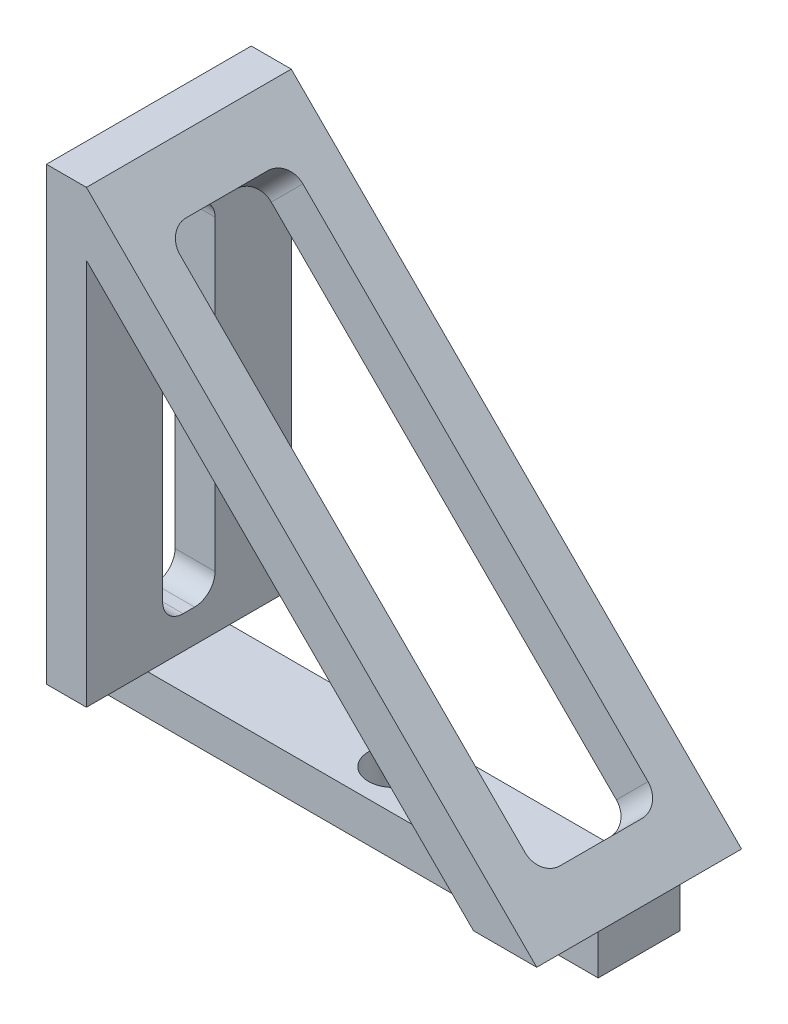
ISO-10303-21;
HEADER;
FILE_DESCRIPTION(('STEP AP214'),'2;1');
FILE_NAME('part.step','',(''),(''),'','','');
FILE_SCHEMA(('AUTOMOTIVE_DESIGN { 1 0 10303 214 1 1 1 1 }'));
ENDSEC;
DATA;
#1=APPLICATION_CONTEXT('core data for automotive mechanical design processes');
#2=APPLICATION_PROTOCOL_DEFINITION('international standard','automotive_design',2000,#1);
#3=PRODUCT_CONTEXT('',#1,'mechanical');
#4=PRODUCT('Part','Part','',(#3));
#5=PRODUCT_RELATED_PRODUCT_CATEGORY('part','',(#4));
#6=PRODUCT_DEFINITION_FORMATION('','',#4);
#7=PRODUCT_DEFINITION_CONTEXT('part definition',#1,'design');
#8=PRODUCT_DEFINITION('design','',#6,#7);
#9=PRODUCT_DEFINITION_SHAPE('','',#8);
#10=(LENGTH_UNIT() NAMED_UNIT(*) SI_UNIT(.MILLI.,.METRE.));
#11=(NAMED_UNIT(*) PLANE_ANGLE_UNIT() SI_UNIT($,.RADIAN.));
#12=(NAMED_UNIT(*) SI_UNIT($,.STERADIAN.) SOLID_ANGLE_UNIT());
#13=UNCERTAINTY_MEASURE_WITH_UNIT(LENGTH_MEASURE(1.E-05),#10,'distance_accuracy_value','');
#14=(GEOMETRIC_REPRESENTATION_CONTEXT(3) GLOBAL_UNCERTAINTY_ASSIGNED_CONTEXT((#13)) GLOBAL_UNIT_ASSIGNED_CONTEXT((#10,
#11,#12)) REPRESENTATION_CONTEXT('',''));
#15=CARTESIAN_POINT('',(0.,0.,0.));
#16=DIRECTION('',(0.,0.,1.));
#17=DIRECTION('',(1.,0.,0.));
#18=AXIS2_PLACEMENT_3D('',#15,#16,#17);
#19=CARTESIAN_POINT('',(0.,0.,15.875));
#20=DIRECTION('',(0.,0.,-1.));
#21=DIRECTION('',(-1.,0.,0.));
#22=AXIS2_PLACEMENT_3D('',#19,#20,#21);
#23=PLANE('',#22);
#24=DIRECTION('',(0.,-1.,0.));
#25=VECTOR('',#24,1.);
#26=CARTESIAN_POINT('',(-6.20000000000001,69.8,15.875));
#27=LINE('',#26,#25);
#28=CARTESIAN_POINT('',(-6.20000000000001,69.8,15.875));
#29=VERTEX_POINT('',#28);
#30=CARTESIAN_POINT('',(-6.20000000000001,0.,15.875));
#31=VERTEX_POINT('',#30);
#32=EDGE_CURVE('E419',#29,#31,#27,.T.);
#33=ORIENTED_EDGE('',*,*,#32,.T.);
#34=DIRECTION('',(1.,0.,0.));
#35=VECTOR('',#34,1.);
#36=CARTESIAN_POINT('',(-6.20100000000001,0.,15.875));
#37=LINE('',#36,#35);
#38=CARTESIAN_POINT('',(0.,0.,15.875));
#39=VERTEX_POINT('',#38);
#40=EDGE_CURVE('E452',#31,#39,#37,.T.);
#41=ORIENTED_EDGE('',*,*,#40,.T.);
#42=DIRECTION('',(0.,-1.,0.));
#43=VECTOR('',#42,1.);
#44=CARTESIAN_POINT('',(0.,0.,15.875));
#45=LINE('',#44,#43);
#46=CARTESIAN_POINT('',(0.,60.,15.875));
#47=VERTEX_POINT('',#46);
#48=EDGE_CURVE('E391',#47,#39,#45,.T.);
#49=ORIENTED_EDGE('',*,*,#48,.F.);
#50=DIRECTION('',(-0.707106781186547,0.707106781186547,0.));
#51=VECTOR('',#50,1.);
#52=CARTESIAN_POINT('',(0.,60.,15.875));
#53=LINE('',#52,#51);
#54=CARTESIAN_POINT('',(60.,0.,15.875));
#55=VERTEX_POINT('',#54);
#56=EDGE_CURVE('E394',#55,#47,#53,.T.);
#57=ORIENTED_EDGE('',*,*,#56,.F.);
#58=CARTESIAN_POINT('',(69.8,0.,15.875));
#59=VERTEX_POINT('',#58);
#60=EDGE_CURVE('E580',#55,#59,#37,.T.);
#61=ORIENTED_EDGE('',*,*,#60,.T.);
#62=DIRECTION('',(-0.707106781186548,0.707106781186547,0.));
#63=VECTOR('',#62,1.);
#64=CARTESIAN_POINT('',(0.,69.8,15.875));
#65=LINE('',#64,#63);
#66=CARTESIAN_POINT('',(0.,69.8,15.875));
#67=VERTEX_POINT('',#66);
#68=EDGE_CURVE('E413',#59,#67,#65,.T.);
#69=ORIENTED_EDGE('',*,*,#68,.T.);
#70=DIRECTION('',(-1.,0.,0.));
#71=VECTOR('',#70,1.);
#72=CARTESIAN_POINT('',(-6.20000000000001,69.8,15.875));
#73=LINE('',#72,#71);
#74=EDGE_CURVE('E416',#67,#29,#73,.T.);
#75=ORIENTED_EDGE('',*,*,#74,.T.);
#76=EDGE_LOOP('',(#33,#41,#49,#57,#61,#69,#75));
#77=FACE_BOUND('',#76,.T.);
#78=ADVANCED_FACE('F38',(#77),#23,.F.);
#79=CARTESIAN_POINT('',(0.,0.,-15.875));
#80=DIRECTION('',(0.,0.,-1.));
#81=DIRECTION('',(-1.,0.,0.));
#82=AXIS2_PLACEMENT_3D('',#79,#80,#81);
#83=PLANE('',#82);
#84=DIRECTION('',(1.,0.,0.));
#85=VECTOR('',#84,1.);
#86=CARTESIAN_POINT('',(-6.20100000000001,0.,-15.875));
#87=LINE('',#86,#85);
#88=CARTESIAN_POINT('',(-6.20000000000001,0.,-15.875));
#89=VERTEX_POINT('',#88);
#90=CARTESIAN_POINT('',(0.,0.,-15.875));
#91=VERTEX_POINT('',#90);
#92=EDGE_CURVE('E436',#89,#91,#87,.T.);
#93=ORIENTED_EDGE('',*,*,#92,.F.);
#94=DIRECTION('',(0.,-1.,0.));
#95=VECTOR('',#94,1.);
#96=CARTESIAN_POINT('',(-6.20000000000001,69.8,-15.875));
#97=LINE('',#96,#95);
#98=CARTESIAN_POINT('',(-6.20000000000001,69.8,-15.875));
#99=VERTEX_POINT('',#98);
#100=EDGE_CURVE('E417',#99,#89,#97,.T.);
#101=ORIENTED_EDGE('',*,*,#100,.F.);
#102=DIRECTION('',(-1.,0.,0.));
#103=VECTOR('',#102,1.);
#104=CARTESIAN_POINT('',(-6.20000000000001,69.8,-15.875));
#105=LINE('',#104,#103);
#106=CARTESIAN_POINT('',(0.,69.8,-15.875));
#107=VERTEX_POINT('',#106);
#108=EDGE_CURVE('E424',#107,#99,#105,.T.);
#109=ORIENTED_EDGE('',*,*,#108,.F.);
#110=DIRECTION('',(-0.707106781186548,0.707106781186547,0.));
#111=VECTOR('',#110,1.);
#112=CARTESIAN_POINT('',(0.,69.8,-15.875));
#113=LINE('',#112,#111);
#114=CARTESIAN_POINT('',(69.8,0.,-15.875));
#115=VERTEX_POINT('',#114);
#116=EDGE_CURVE('E412',#115,#107,#113,.T.);
#117=ORIENTED_EDGE('',*,*,#116,.F.);
#118=CARTESIAN_POINT('',(60.,0.,-15.875));
#119=VERTEX_POINT('',#118);
#120=EDGE_CURVE('E440',#119,#115,#87,.T.);
#121=ORIENTED_EDGE('',*,*,#120,.F.);
#122=DIRECTION('',(-0.707106781186547,0.707106781186547,0.));
#123=VECTOR('',#122,1.);
#124=CARTESIAN_POINT('',(0.,60.,-15.875));
#125=LINE('',#124,#123);
#126=CARTESIAN_POINT('',(0.,60.,-15.875));
#127=VERTEX_POINT('',#126);
#128=EDGE_CURVE('E395',#119,#127,#125,.T.);
#129=ORIENTED_EDGE('',*,*,#128,.T.);
#130=DIRECTION('',(0.,-1.,0.));
#131=VECTOR('',#130,1.);
#132=CARTESIAN_POINT('',(0.,0.,-15.875));
#133=LINE('',#132,#131);
#134=EDGE_CURVE('E390',#127,#91,#133,.T.);
#135=ORIENTED_EDGE('',*,*,#134,.T.);
#136=EDGE_LOOP('',(#93,#101,#109,#117,#121,#129,#135));
#137=FACE_BOUND('',#136,.T.);
#138=ADVANCED_FACE('F434',(#137),#83,.T.);
#139=CARTESIAN_POINT('',(0.,69.8,15.875));
#140=DIRECTION('',(-0.707106781186547,-0.707106781186548,0.));
#141=DIRECTION('',(0.707106781186548,-0.707106781186547,0.));
#142=AXIS2_PLACEMENT_3D('',#139,#140,#141);
#143=PLANE('',#142);
#144=DIRECTION('',(0.707106781186548,-0.707106781186547,0.));
#145=VECTOR('',#144,1.);
#146=CARTESIAN_POINT('',(63.8913780286485,5.90862197135156,9.525));
#147=LINE('',#146,#145);
#148=CARTESIAN_POINT('',(8.15368600161884,61.6463139983812,9.525));
#149=VERTEX_POINT('',#148);
#150=CARTESIAN_POINT('',(61.6463139983812,8.15368600161885,9.525));
#151=VERTEX_POINT('',#150);
#152=EDGE_CURVE('E381',#149,#151,#147,.T.);
#153=ORIENTED_EDGE('',*,*,#152,.F.);
#154=CARTESIAN_POINT('',(8.15368600161884,61.6463139983812,6.35));
#155=DIRECTION('',(-0.707106781186547,-0.707106781186548,0.));
#156=DIRECTION('',(0.707106781186548,-0.707106781186547,0.));
#157=AXIS2_PLACEMENT_3D('',#154,#155,#156);
#158=CIRCLE('',#157,3.175);
#159=CARTESIAN_POINT('',(5.90862197135155,63.8913780286485,6.35));
#160=VERTEX_POINT('',#159);
#161=EDGE_CURVE('E301',#149,#160,#158,.T.);
#162=ORIENTED_EDGE('',*,*,#161,.T.);
#163=DIRECTION('',(0.,0.,1.));
#164=VECTOR('',#163,1.);
#165=CARTESIAN_POINT('',(5.90862197135155,63.8913780286485,9.525));
#166=LINE('',#165,#164);
#167=CARTESIAN_POINT('',(5.90862197135155,63.8913780286485,-6.34999999999999));
#168=VERTEX_POINT('',#167);
#169=EDGE_CURVE('E378',#168,#160,#166,.T.);
#170=ORIENTED_EDGE('',*,*,#169,.F.);
#171=CARTESIAN_POINT('',(8.15368600161883,61.6463139983812,-6.35));
#172=DIRECTION('',(-0.707106781186547,-0.707106781186548,0.));
#173=DIRECTION('',(0.707106781186548,-0.707106781186547,0.));
#174=AXIS2_PLACEMENT_3D('',#171,#172,#173);
#175=CIRCLE('',#174,3.175);
#176=CARTESIAN_POINT('',(8.15368600161884,61.6463139983812,-9.525));
#177=VERTEX_POINT('',#176);
#178=EDGE_CURVE('E297',#168,#177,#175,.T.);
#179=ORIENTED_EDGE('',*,*,#178,.T.);
#180=DIRECTION('',(-0.707106781186548,0.707106781186547,0.));
#181=VECTOR('',#180,1.);
#182=CARTESIAN_POINT('',(63.8913780286485,5.90862197135156,-9.525));
#183=LINE('',#182,#181);
#184=CARTESIAN_POINT('',(61.6463139983812,8.15368600161885,-9.525));
#185=VERTEX_POINT('',#184);
#186=EDGE_CURVE('E375',#185,#177,#183,.T.);
#187=ORIENTED_EDGE('',*,*,#186,.F.);
#188=CARTESIAN_POINT('',(61.6463139983812,8.15368600161884,-6.35));
#189=DIRECTION('',(-0.707106781186547,-0.707106781186548,0.));
#190=DIRECTION('',(0.707106781186548,-0.707106781186547,0.));
#191=AXIS2_PLACEMENT_3D('',#188,#189,#190);
#192=CIRCLE('',#191,3.175);
#193=CARTESIAN_POINT('',(63.8913780286485,5.90862197135156,-6.34999999999999));
#194=VERTEX_POINT('',#193);
#195=EDGE_CURVE('E293',#185,#194,#192,.T.);
#196=ORIENTED_EDGE('',*,*,#195,.T.);
#197=DIRECTION('',(0.,0.,-1.));
#198=VECTOR('',#197,1.);
#199=CARTESIAN_POINT('',(63.8913780286485,5.90862197135156,9.525));
#200=LINE('',#199,#198);
#201=CARTESIAN_POINT('',(63.8913780286485,5.90862197135156,6.35));
#202=VERTEX_POINT('',#201);
#203=EDGE_CURVE('E384',#202,#194,#200,.T.);
#204=ORIENTED_EDGE('',*,*,#203,.F.);
#205=CARTESIAN_POINT('',(61.6463139983812,8.15368600161884,6.35));
#206=DIRECTION('',(-0.707106781186547,-0.707106781186548,0.));
#207=DIRECTION('',(0.707106781186548,-0.707106781186547,0.));
#208=AXIS2_PLACEMENT_3D('',#205,#206,#207);
#209=CIRCLE('',#208,3.175);
#210=EDGE_CURVE('E289',#202,#151,#209,.T.);
#211=ORIENTED_EDGE('',*,*,#210,.T.);
#212=EDGE_LOOP('',(#153,#162,#170,#179,#187,#196,#204,#211));
#213=FACE_BOUND('',#212,.T.);
#214=ORIENTED_EDGE('',*,*,#116,.T.);
#215=DIRECTION('',(0.,0.,-1.));
#216=VECTOR('',#215,1.);
#217=CARTESIAN_POINT('',(0.,69.8,15.875));
#218=LINE('',#217,#216);
#219=EDGE_CURVE('E266',#67,#107,#218,.T.);
#220=ORIENTED_EDGE('',*,*,#219,.F.);
#221=ORIENTED_EDGE('',*,*,#68,.F.);
#222=DIRECTION('',(0.,0.,-1.));
#223=VECTOR('',#222,1.);
#224=CARTESIAN_POINT('',(69.8,0.,15.875));
#225=LINE('',#224,#223);
#226=CARTESIAN_POINT('',(69.8,0.,6.35));
#227=VERTEX_POINT('',#226);
#228=EDGE_CURVE('E257',#59,#227,#225,.T.);
#229=ORIENTED_EDGE('',*,*,#228,.T.);
#230=CARTESIAN_POINT('',(69.8,0.,-6.35));
#231=VERTEX_POINT('',#230);
#232=EDGE_CURVE('E249',#227,#231,#225,.T.);
#233=ORIENTED_EDGE('',*,*,#232,.T.);
#234=DIRECTION('',(0.,0.,1.));
#235=VECTOR('',#234,1.);
#236=CARTESIAN_POINT('',(69.8,0.,-15.875));
#237=LINE('',#236,#235);
#238=EDGE_CURVE('E564',#115,#231,#237,.T.);
#239=ORIENTED_EDGE('',*,*,#238,.F.);
#240=EDGE_LOOP('',(#214,#220,#221,#229,#233,#239));
#241=FACE_BOUND('',#240,.T.);
#242=ADVANCED_FACE('F492',(#213,#241),#143,.F.);
#243=CARTESIAN_POINT('',(-6.20000000000001,69.8,15.875));
#244=DIRECTION('',(0.,-1.,0.));
#245=DIRECTION('',(1.,0.,0.));
#246=AXIS2_PLACEMENT_3D('',#243,#244,#245);
#247=PLANE('',#246);
#248=ORIENTED_EDGE('',*,*,#108,.T.);
#249=DIRECTION('',(0.,0.,-1.));
#250=VECTOR('',#249,1.);
#251=CARTESIAN_POINT('',(-6.20000000000001,69.8,15.875));
#252=LINE('',#251,#250);
#253=EDGE_CURVE('E259',#29,#99,#252,.T.);
#254=ORIENTED_EDGE('',*,*,#253,.F.);
#255=ORIENTED_EDGE('',*,*,#74,.F.);
#256=ORIENTED_EDGE('',*,*,#219,.T.);
#257=EDGE_LOOP('',(#248,#254,#255,#256));
#258=FACE_BOUND('',#257,.T.);
#259=ADVANCED_FACE('F504',(#258),#247,.F.);
#260=CARTESIAN_POINT('',(-6.20000000000001,69.8,15.875));
#261=DIRECTION('',(1.,0.,0.));
#262=DIRECTION('',(0.,0.,-1.));
#263=AXIS2_PLACEMENT_3D('',#260,#261,#262);
#264=PLANE('',#263);
#265=DIRECTION('',(0.,0.,1.));
#266=VECTOR('',#265,1.);
#267=CARTESIAN_POINT('',(-6.20000000000001,5.08,4.064));
#268=LINE('',#267,#266);
#269=CARTESIAN_POINT('',(-6.20000000000001,5.08,-0.889));
#270=VERTEX_POINT('',#269);
#271=CARTESIAN_POINT('',(-6.20000000000001,5.08,0.889));
#272=VERTEX_POINT('',#271);
#273=EDGE_CURVE('E455',#270,#272,#268,.T.);
#274=ORIENTED_EDGE('',*,*,#273,.F.);
#275=CARTESIAN_POINT('',(-6.20000000000001,8.255,-0.889));
#276=DIRECTION('',(1.,0.,0.));
#277=DIRECTION('',(0.,0.,-1.));
#278=AXIS2_PLACEMENT_3D('',#275,#276,#277);
#279=CIRCLE('',#278,3.175);
#280=CARTESIAN_POINT('',(-6.20000000000001,8.255,-4.064));
#281=VERTEX_POINT('',#280);
#282=EDGE_CURVE('E330',#270,#281,#279,.T.);
#283=ORIENTED_EDGE('',*,*,#282,.T.);
#284=DIRECTION('',(0.,-1.,0.));
#285=VECTOR('',#284,1.);
#286=CARTESIAN_POINT('',(-6.20000000000001,5.08,-4.064));
#287=LINE('',#286,#285);
#288=CARTESIAN_POINT('',(-6.20000000000001,55.825,-4.064));
#289=VERTEX_POINT('',#288);
#290=EDGE_CURVE('E345',#289,#281,#287,.T.);
#291=ORIENTED_EDGE('',*,*,#290,.F.);
#292=CARTESIAN_POINT('',(-6.20000000000001,55.825,-0.889));
#293=DIRECTION('',(1.,0.,0.));
#294=DIRECTION('',(0.,0.,-1.));
#295=AXIS2_PLACEMENT_3D('',#292,#293,#294);
#296=CIRCLE('',#295,3.175);
#297=CARTESIAN_POINT('',(-6.20000000000001,59.,-0.889));
#298=VERTEX_POINT('',#297);
#299=EDGE_CURVE('E11',#289,#298,#296,.T.);
#300=ORIENTED_EDGE('',*,*,#299,.T.);
#301=DIRECTION('',(0.,0.,-1.));
#302=VECTOR('',#301,1.);
#303=CARTESIAN_POINT('',(-6.20000000000001,59.,4.064));
#304=LINE('',#303,#302);
#305=CARTESIAN_POINT('',(-6.20000000000001,59.,0.889));
#306=VERTEX_POINT('',#305);
#307=EDGE_CURVE('E354',#306,#298,#304,.T.);
#308=ORIENTED_EDGE('',*,*,#307,.F.);
#309=CARTESIAN_POINT('',(-6.20000000000001,55.825,0.889));
#310=DIRECTION('',(1.,0.,0.));
#311=DIRECTION('',(0.,0.,-1.));
#312=AXIS2_PLACEMENT_3D('',#309,#310,#311);
#313=CIRCLE('',#312,3.175);
#314=CARTESIAN_POINT('',(-6.20000000000001,55.825,4.064));
#315=VERTEX_POINT('',#314);
#316=EDGE_CURVE('E333',#306,#315,#313,.T.);
#317=ORIENTED_EDGE('',*,*,#316,.T.);
#318=DIRECTION('',(0.,1.,0.));
#319=VECTOR('',#318,1.);
#320=CARTESIAN_POINT('',(-6.20000000000001,5.08,4.064));
#321=LINE('',#320,#319);
#322=CARTESIAN_POINT('',(-6.20000000000001,8.255,4.064));
#323=VERTEX_POINT('',#322);
#324=EDGE_CURVE('E451',#323,#315,#321,.T.);
#325=ORIENTED_EDGE('',*,*,#324,.F.);
#326=CARTESIAN_POINT('',(-6.20000000000001,8.255,0.889));
#327=DIRECTION('',(1.,0.,0.));
#328=DIRECTION('',(0.,0.,-1.));
#329=AXIS2_PLACEMENT_3D('',#326,#327,#328);
#330=CIRCLE('',#329,3.175);
#331=EDGE_CURVE('E326',#323,#272,#330,.T.);
#332=ORIENTED_EDGE('',*,*,#331,.T.);
#333=EDGE_LOOP('',(#274,#283,#291,#300,#308,#317,#325,#332));
#334=FACE_BOUND('',#333,.T.);
#335=DIRECTION('',(0.,0.,-1.));
#336=VECTOR('',#335,1.);
#337=CARTESIAN_POINT('',(-6.20000000000001,-6.19999999999997,15.875));
#338=LINE('',#337,#336);
#339=CARTESIAN_POINT('',(-6.20000000000001,-6.19999999999997,6.35));
#340=VERTEX_POINT('',#339);
#341=CARTESIAN_POINT('',(-6.20000000000001,-6.19999999999997,-6.35));
#342=VERTEX_POINT('',#341);
#343=EDGE_CURVE('E256',#340,#342,#338,.T.);
#344=ORIENTED_EDGE('',*,*,#343,.F.);
#345=DIRECTION('',(0.,-1.,0.));
#346=VECTOR('',#345,1.);
#347=CARTESIAN_POINT('',(-6.20000000000001,-6.19999999999997,6.35));
#348=LINE('',#347,#346);
#349=CARTESIAN_POINT('',(-6.20000000000001,0.,6.35));
#350=VERTEX_POINT('',#349);
#351=EDGE_CURVE('E236',#350,#340,#348,.T.);
#352=ORIENTED_EDGE('',*,*,#351,.F.);
#353=DIRECTION('',(0.,0.,-1.));
#354=VECTOR('',#353,1.);
#355=CARTESIAN_POINT('',(-6.20000000000001,0.,15.875));
#356=LINE('',#355,#354);
#357=EDGE_CURVE('E251',#31,#350,#356,.T.);
#358=ORIENTED_EDGE('',*,*,#357,.F.);
#359=ORIENTED_EDGE('',*,*,#32,.F.);
#360=ORIENTED_EDGE('',*,*,#253,.T.);
#361=ORIENTED_EDGE('',*,*,#100,.T.);
#362=DIRECTION('',(0.,0.,-1.));
#363=VECTOR('',#362,1.);
#364=CARTESIAN_POINT('',(-6.20000000000001,0.,-15.875));
#365=LINE('',#364,#363);
#366=CARTESIAN_POINT('',(-6.20000000000001,0.,-6.35));
#367=VERTEX_POINT('',#366);
#368=EDGE_CURVE('E429',#367,#89,#365,.T.);
#369=ORIENTED_EDGE('',*,*,#368,.F.);
#370=DIRECTION('',(0.,1.,0.));
#371=VECTOR('',#370,1.);
#372=CARTESIAN_POINT('',(-6.20000000000001,-6.19999999999997,-6.35));
#373=LINE('',#372,#371);
#374=EDGE_CURVE('E588',#342,#367,#373,.T.);
#375=ORIENTED_EDGE('',*,*,#374,.F.);
#376=EDGE_LOOP('',(#344,#352,#358,#359,#360,#361,#369,#375));
#377=FACE_BOUND('',#376,.T.);
#378=ADVANCED_FACE('F352',(#334,#377),#264,.F.);
#379=CARTESIAN_POINT('',(-6.20000000000001,-6.19999999999997,15.875));
#380=DIRECTION('',(0.,1.,0.));
#381=DIRECTION('',(0.,0.,1.));
#382=AXIS2_PLACEMENT_3D('',#379,#380,#381);
#383=PLANE('',#382);
#384=CARTESIAN_POINT('',(31.8,-6.19999999999997,0.));
#385=DIRECTION('',(0.,-1.,0.));
#386=DIRECTION('',(0.,0.,-1.));
#387=AXIS2_PLACEMENT_3D('',#384,#385,#386);
#388=CIRCLE('',#387,3.96874999999999);
#389=CARTESIAN_POINT('',(31.8,-6.19999999999997,-3.96874999999999));
#390=VERTEX_POINT('',#389);
#391=EDGE_CURVE('E608',#390,#390,#388,.T.);
#392=ORIENTED_EDGE('',*,*,#391,.F.);
#393=EDGE_LOOP('',(#392));
#394=FACE_BOUND('',#393,.T.);
#395=DIRECTION('',(0.,0.,-1.));
#396=VECTOR('',#395,1.);
#397=CARTESIAN_POINT('',(69.8,-6.19999999999997,15.875));
#398=LINE('',#397,#396);
#399=CARTESIAN_POINT('',(69.8,-6.19999999999997,6.35));
#400=VERTEX_POINT('',#399);
#401=CARTESIAN_POINT('',(69.8,-6.19999999999997,-6.35));
#402=VERTEX_POINT('',#401);
#403=EDGE_CURVE('E247',#400,#402,#398,.T.);
#404=ORIENTED_EDGE('',*,*,#403,.F.);
#405=DIRECTION('',(1.,0.,0.));
#406=VECTOR('',#405,1.);
#407=CARTESIAN_POINT('',(-6.20100000000001,-6.19999999999997,6.35));
#408=LINE('',#407,#406);
#409=EDGE_CURVE('E229',#340,#400,#408,.T.);
#410=ORIENTED_EDGE('',*,*,#409,.F.);
#411=ORIENTED_EDGE('',*,*,#343,.T.);
#412=DIRECTION('',(1.,0.,0.));
#413=VECTOR('',#412,1.);
#414=CARTESIAN_POINT('',(-6.20100000000001,-6.19999999999997,-6.35));
#415=LINE('',#414,#413);
#416=EDGE_CURVE('E255',#342,#402,#415,.T.);
#417=ORIENTED_EDGE('',*,*,#416,.T.);
#418=EDGE_LOOP('',(#404,#410,#411,#417));
#419=FACE_BOUND('',#418,.T.);
#420=ADVANCED_FACE('F254',(#394,#419),#383,.F.);
#421=CARTESIAN_POINT('',(69.8,0.,15.875));
#422=DIRECTION('',(-1.,0.,0.));
#423=DIRECTION('',(0.,0.,1.));
#424=AXIS2_PLACEMENT_3D('',#421,#422,#423);
#425=PLANE('',#424);
#426=ORIENTED_EDGE('',*,*,#232,.F.);
#427=DIRECTION('',(0.,1.,0.));
#428=VECTOR('',#427,1.);
#429=CARTESIAN_POINT('',(69.8,-6.19999999999997,6.35));
#430=LINE('',#429,#428);
#431=EDGE_CURVE('E233',#400,#227,#430,.T.);
#432=ORIENTED_EDGE('',*,*,#431,.F.);
#433=ORIENTED_EDGE('',*,*,#403,.T.);
#434=DIRECTION('',(0.,-1.,0.));
#435=VECTOR('',#434,1.);
#436=CARTESIAN_POINT('',(69.8,-6.19999999999997,-6.35));
#437=LINE('',#436,#435);
#438=EDGE_CURVE('E445',#231,#402,#437,.T.);
#439=ORIENTED_EDGE('',*,*,#438,.F.);
#440=EDGE_LOOP('',(#426,#432,#433,#439));
#441=FACE_BOUND('',#440,.T.);
#442=ADVANCED_FACE('F245',(#441),#425,.F.);
#443=CARTESIAN_POINT('',(0.,0.,15.875));
#444=DIRECTION('',(1.,0.,0.));
#445=DIRECTION('',(0.,0.,-1.));
#446=AXIS2_PLACEMENT_3D('',#443,#444,#445);
#447=PLANE('',#446);
#448=DIRECTION('',(0.,1.,0.));
#449=VECTOR('',#448,1.);
#450=CARTESIAN_POINT('',(0.,5.08,-4.064));
#451=LINE('',#450,#449);
#452=CARTESIAN_POINT('',(0.,8.255,-4.064));
#453=VERTEX_POINT('',#452);
#454=CARTESIAN_POINT('',(0.,55.825,-4.064));
#455=VERTEX_POINT('',#454);
#456=EDGE_CURVE('E338',#453,#455,#451,.T.);
#457=ORIENTED_EDGE('',*,*,#456,.F.);
#458=CARTESIAN_POINT('',(0.,8.255,-0.889));
#459=DIRECTION('',(1.,0.,0.));
#460=DIRECTION('',(0.,0.,-1.));
#461=AXIS2_PLACEMENT_3D('',#458,#459,#460);
#462=CIRCLE('',#461,3.175);
#463=CARTESIAN_POINT('',(0.,5.08,-0.889));
#464=VERTEX_POINT('',#463);
#465=EDGE_CURVE('E328',#453,#464,#462,.F.);
#466=ORIENTED_EDGE('',*,*,#465,.T.);
#467=DIRECTION('',(0.,0.,-1.));
#468=VECTOR('',#467,1.);
#469=CARTESIAN_POINT('',(0.,5.08,4.064));
#470=LINE('',#469,#468);
#471=CARTESIAN_POINT('',(0.,5.08,0.889));
#472=VERTEX_POINT('',#471);
#473=EDGE_CURVE('E360',#472,#464,#470,.T.);
#474=ORIENTED_EDGE('',*,*,#473,.F.);
#475=CARTESIAN_POINT('',(0.,8.255,0.889));
#476=DIRECTION('',(1.,0.,0.));
#477=DIRECTION('',(0.,0.,-1.));
#478=AXIS2_PLACEMENT_3D('',#475,#476,#477);
#479=CIRCLE('',#478,3.175);
#480=CARTESIAN_POINT('',(0.,8.255,4.064));
#481=VERTEX_POINT('',#480);
#482=EDGE_CURVE('E324',#472,#481,#479,.F.);
#483=ORIENTED_EDGE('',*,*,#482,.T.);
#484=DIRECTION('',(0.,-1.,0.));
#485=VECTOR('',#484,1.);
#486=CARTESIAN_POINT('',(0.,5.08,4.064));
#487=LINE('',#486,#485);
#488=CARTESIAN_POINT('',(0.,55.825,4.064));
#489=VERTEX_POINT('',#488);
#490=EDGE_CURVE('E366',#489,#481,#487,.T.);
#491=ORIENTED_EDGE('',*,*,#490,.F.);
#492=CARTESIAN_POINT('',(0.,55.825,0.889));
#493=DIRECTION('',(1.,0.,0.));
#494=DIRECTION('',(0.,0.,-1.));
#495=AXIS2_PLACEMENT_3D('',#492,#493,#494);
#496=CIRCLE('',#495,3.175);
#497=CARTESIAN_POINT('',(0.,59.,0.889));
#498=VERTEX_POINT('',#497);
#499=EDGE_CURVE('E53',#489,#498,#496,.F.);
#500=ORIENTED_EDGE('',*,*,#499,.T.);
#501=DIRECTION('',(0.,0.,1.));
#502=VECTOR('',#501,1.);
#503=CARTESIAN_POINT('',(0.,59.,4.064));
#504=LINE('',#503,#502);
#505=CARTESIAN_POINT('',(0.,59.,-0.889));
#506=VERTEX_POINT('',#505);
#507=EDGE_CURVE('E339',#506,#498,#504,.T.);
#508=ORIENTED_EDGE('',*,*,#507,.F.);
#509=CARTESIAN_POINT('',(0.,55.825,-0.889));
#510=DIRECTION('',(1.,0.,0.));
#511=DIRECTION('',(0.,0.,-1.));
#512=AXIS2_PLACEMENT_3D('',#509,#510,#511);
#513=CIRCLE('',#512,3.175);
#514=EDGE_CURVE('E46',#506,#455,#513,.F.);
#515=ORIENTED_EDGE('',*,*,#514,.T.);
#516=EDGE_LOOP('',(#457,#466,#474,#483,#491,#500,#508,#515));
#517=FACE_BOUND('',#516,.T.);
#518=ORIENTED_EDGE('',*,*,#134,.F.);
#519=DIRECTION('',(0.,0.,-1.));
#520=VECTOR('',#519,1.);
#521=CARTESIAN_POINT('',(0.,60.,15.875));
#522=LINE('',#521,#520);
#523=EDGE_CURVE('E397',#47,#127,#522,.T.);
#524=ORIENTED_EDGE('',*,*,#523,.F.);
#525=ORIENTED_EDGE('',*,*,#48,.T.);
#526=DIRECTION('',(0.,0.,-1.));
#527=VECTOR('',#526,1.);
#528=CARTESIAN_POINT('',(0.,0.,15.875));
#529=LINE('',#528,#527);
#530=CARTESIAN_POINT('',(0.,0.,6.35));
#531=VERTEX_POINT('',#530);
#532=EDGE_CURVE('E409',#39,#531,#529,.T.);
#533=ORIENTED_EDGE('',*,*,#532,.T.);
#534=CARTESIAN_POINT('',(0.,0.,-6.35));
#535=VERTEX_POINT('',#534);
#536=EDGE_CURVE('E407',#531,#535,#529,.T.);
#537=ORIENTED_EDGE('',*,*,#536,.T.);
#538=DIRECTION('',(0.,0.,1.));
#539=VECTOR('',#538,1.);
#540=CARTESIAN_POINT('',(0.,0.,15.875));
#541=LINE('',#540,#539);
#542=EDGE_CURVE('E449',#91,#535,#541,.T.);
#543=ORIENTED_EDGE('',*,*,#542,.F.);
#544=EDGE_LOOP('',(#518,#524,#525,#533,#537,#543));
#545=FACE_BOUND('',#544,.T.);
#546=ADVANCED_FACE('F336',(#517,#545),#447,.T.);
#547=CARTESIAN_POINT('',(60.,0.,15.875));
#548=DIRECTION('',(0.,1.,0.));
#549=DIRECTION('',(0.,0.,1.));
#550=AXIS2_PLACEMENT_3D('',#547,#548,#549);
#551=PLANE('',#550);
#552=CARTESIAN_POINT('',(31.8,0.,0.));
#553=DIRECTION('',(0.,1.,0.));
#554=DIRECTION('',(0.,0.,1.));
#555=AXIS2_PLACEMENT_3D('',#552,#553,#554);
#556=CIRCLE('',#555,3.96874999999999);
#557=CARTESIAN_POINT('',(31.8,0.,3.96874999999999));
#558=VERTEX_POINT('',#557);
#559=EDGE_CURVE('E591',#558,#558,#556,.T.);
#560=ORIENTED_EDGE('',*,*,#559,.F.);
#561=EDGE_LOOP('',(#560));
#562=FACE_BOUND('',#561,.T.);
#563=DIRECTION('',(1.,0.,0.));
#564=VECTOR('',#563,1.);
#565=CARTESIAN_POINT('',(-6.20100000000001,0.,6.35));
#566=LINE('',#565,#564);
#567=CARTESIAN_POINT('',(60.,0.,6.35));
#568=VERTEX_POINT('',#567);
#569=EDGE_CURVE('E586',#531,#568,#566,.T.);
#570=ORIENTED_EDGE('',*,*,#569,.T.);
#571=DIRECTION('',(0.,0.,-1.));
#572=VECTOR('',#571,1.);
#573=CARTESIAN_POINT('',(60.,0.,15.875));
#574=LINE('',#573,#572);
#575=CARTESIAN_POINT('',(60.,0.,-6.35));
#576=VERTEX_POINT('',#575);
#577=EDGE_CURVE('E408',#568,#576,#574,.T.);
#578=ORIENTED_EDGE('',*,*,#577,.T.);
#579=DIRECTION('',(1.,0.,0.));
#580=VECTOR('',#579,1.);
#581=CARTESIAN_POINT('',(-6.20100000000001,0.,-6.35));
#582=LINE('',#581,#580);
#583=EDGE_CURVE('E442',#535,#576,#582,.T.);
#584=ORIENTED_EDGE('',*,*,#583,.F.);
#585=ORIENTED_EDGE('',*,*,#536,.F.);
#586=EDGE_LOOP('',(#570,#578,#584,#585));
#587=FACE_BOUND('',#586,.T.);
#588=ADVANCED_FACE('F645',(#562,#587),#551,.T.);
#589=CARTESIAN_POINT('',(0.,60.,15.875));
#590=DIRECTION('',(-0.707106781186548,-0.707106781186548,0.));
#591=DIRECTION('',(0.707106781186548,-0.707106781186548,0.));
#592=AXIS2_PLACEMENT_3D('',#589,#590,#591);
#593=PLANE('',#592);
#594=DIRECTION('',(-0.707106781186548,0.707106781186548,0.));
#595=VECTOR('',#594,1.);
#596=CARTESIAN_POINT('',(58.9913780286484,1.00862197135154,-9.525));
#597=LINE('',#596,#595);
#598=CARTESIAN_POINT('',(56.7463139983812,3.25368600161883,-9.525));
#599=VERTEX_POINT('',#598);
#600=CARTESIAN_POINT('',(3.25368600161882,56.7463139983812,-9.525));
#601=VERTEX_POINT('',#600);
#602=EDGE_CURVE('E372',#599,#601,#597,.T.);
#603=ORIENTED_EDGE('',*,*,#602,.T.);
#604=CARTESIAN_POINT('',(3.25368600161884,56.7463139983812,-6.35));
#605=DIRECTION('',(-0.707106781186548,-0.707106781186548,0.));
#606=DIRECTION('',(0.707106781186548,-0.707106781186548,0.));
#607=AXIS2_PLACEMENT_3D('',#604,#605,#606);
#608=CIRCLE('',#607,3.175);
#609=CARTESIAN_POINT('',(1.00862197135155,58.9913780286485,-6.35));
#610=VERTEX_POINT('',#609);
#611=EDGE_CURVE('E299',#601,#610,#608,.F.);
#612=ORIENTED_EDGE('',*,*,#611,.T.);
#613=DIRECTION('',(0.,0.,1.));
#614=VECTOR('',#613,1.);
#615=CARTESIAN_POINT('',(1.00862197135155,58.9913780286485,9.525));
#616=LINE('',#615,#614);
#617=CARTESIAN_POINT('',(1.00862197135155,58.9913780286485,6.35));
#618=VERTEX_POINT('',#617);
#619=EDGE_CURVE('E387',#610,#618,#616,.T.);
#620=ORIENTED_EDGE('',*,*,#619,.T.);
#621=CARTESIAN_POINT('',(3.25368600161884,56.7463139983812,6.35));
#622=DIRECTION('',(-0.707106781186548,-0.707106781186548,0.));
#623=DIRECTION('',(0.707106781186548,-0.707106781186548,0.));
#624=AXIS2_PLACEMENT_3D('',#621,#622,#623);
#625=CIRCLE('',#624,3.175);
#626=CARTESIAN_POINT('',(3.25368600161883,56.7463139983812,9.525));
#627=VERTEX_POINT('',#626);
#628=EDGE_CURVE('E303',#618,#627,#625,.F.);
#629=ORIENTED_EDGE('',*,*,#628,.T.);
#630=DIRECTION('',(0.707106781186548,-0.707106781186548,0.));
#631=VECTOR('',#630,1.);
#632=CARTESIAN_POINT('',(58.9913780286484,1.00862197135154,9.525));
#633=LINE('',#632,#631);
#634=CARTESIAN_POINT('',(56.7463139983812,3.25368600161883,9.525));
#635=VERTEX_POINT('',#634);
#636=EDGE_CURVE('E359',#627,#635,#633,.T.);
#637=ORIENTED_EDGE('',*,*,#636,.T.);
#638=CARTESIAN_POINT('',(56.7463139983812,3.25368600161884,6.35));
#639=DIRECTION('',(-0.707106781186548,-0.707106781186548,0.));
#640=DIRECTION('',(0.707106781186548,-0.707106781186548,0.));
#641=AXIS2_PLACEMENT_3D('',#638,#639,#640);
#642=CIRCLE('',#641,3.175);
#643=CARTESIAN_POINT('',(58.9913780286485,1.00862197135156,6.35));
#644=VERTEX_POINT('',#643);
#645=EDGE_CURVE('E291',#635,#644,#642,.F.);
#646=ORIENTED_EDGE('',*,*,#645,.T.);
#647=DIRECTION('',(0.,0.,-1.));
#648=VECTOR('',#647,1.);
#649=CARTESIAN_POINT('',(58.9913780286485,1.00862197135156,9.525));
#650=LINE('',#649,#648);
#651=CARTESIAN_POINT('',(58.9913780286485,1.00862197135156,-6.35));
#652=VERTEX_POINT('',#651);
#653=EDGE_CURVE('E363',#644,#652,#650,.T.);
#654=ORIENTED_EDGE('',*,*,#653,.T.);
#655=CARTESIAN_POINT('',(56.7463139983812,3.25368600161884,-6.35));
#656=DIRECTION('',(-0.707106781186548,-0.707106781186548,0.));
#657=DIRECTION('',(0.707106781186548,-0.707106781186548,0.));
#658=AXIS2_PLACEMENT_3D('',#655,#656,#657);
#659=CIRCLE('',#658,3.175);
#660=EDGE_CURVE('E295',#652,#599,#659,.F.);
#661=ORIENTED_EDGE('',*,*,#660,.T.);
#662=EDGE_LOOP('',(#603,#612,#620,#629,#637,#646,#654,#661));
#663=FACE_BOUND('',#662,.T.);
#664=ORIENTED_EDGE('',*,*,#128,.F.);
#665=EDGE_CURVE('E404',#576,#119,#574,.T.);
#666=ORIENTED_EDGE('',*,*,#665,.F.);
#667=ORIENTED_EDGE('',*,*,#577,.F.);
#668=EDGE_CURVE('E405',#55,#568,#574,.T.);
#669=ORIENTED_EDGE('',*,*,#668,.F.);
#670=ORIENTED_EDGE('',*,*,#56,.T.);
#671=ORIENTED_EDGE('',*,*,#523,.T.);
#672=EDGE_LOOP('',(#664,#666,#667,#669,#670,#671));
#673=FACE_BOUND('',#672,.T.);
#674=ADVANCED_FACE('F533',(#663,#673),#593,.T.);
#675=CARTESIAN_POINT('',(-35.1923780286484,22.7903780286485,9.525));
#676=DIRECTION('',(-0.707106781186548,0.707106781186547,0.));
#677=DIRECTION('',(-0.707106781186547,-0.707106781186548,0.));
#678=AXIS2_PLACEMENT_3D('',#675,#676,#677);
#679=PLANE('',#678);
#680=ORIENTED_EDGE('',*,*,#619,.F.);
#681=DIRECTION('',(0.707106781186547,0.707106781186548,0.));
#682=VECTOR('',#681,1.);
#683=CARTESIAN_POINT('',(5.90862197135155,63.8913780286485,-6.35));
#684=LINE('',#683,#682);
#685=EDGE_CURVE('E286',#610,#168,#684,.T.);
#686=ORIENTED_EDGE('',*,*,#685,.T.);
#687=ORIENTED_EDGE('',*,*,#169,.T.);
#688=DIRECTION('',(0.707106781186547,0.707106781186548,0.));
#689=VECTOR('',#688,1.);
#690=CARTESIAN_POINT('',(1.00862197135155,58.9913780286484,6.35));
#691=LINE('',#690,#689);
#692=EDGE_CURVE('E284',#160,#618,#691,.F.);
#693=ORIENTED_EDGE('',*,*,#692,.T.);
#694=EDGE_LOOP('',(#680,#686,#687,#693));
#695=FACE_BOUND('',#694,.T.);
#696=ADVANCED_FACE('F557',(#695),#679,.F.);
#697=CARTESIAN_POINT('',(22.7903780286485,-35.1923780286484,9.525));
#698=DIRECTION('',(0.,0.,1.));
#699=DIRECTION('',(1.,0.,0.));
#700=AXIS2_PLACEMENT_3D('',#697,#698,#699);
#701=PLANE('',#700);
#702=ORIENTED_EDGE('',*,*,#152,.T.);
#703=DIRECTION('',(0.707106781186547,0.707106781186548,0.));
#704=VECTOR('',#703,1.);
#705=CARTESIAN_POINT('',(56.7463139983812,3.25368600161883,9.525));
#706=LINE('',#705,#704);
#707=EDGE_CURVE('E277',#151,#635,#706,.F.);
#708=ORIENTED_EDGE('',*,*,#707,.T.);
#709=ORIENTED_EDGE('',*,*,#636,.F.);
#710=DIRECTION('',(0.707106781186547,0.707106781186548,0.));
#711=VECTOR('',#710,1.);
#712=CARTESIAN_POINT('',(8.15368600161884,61.6463139983812,9.525));
#713=LINE('',#712,#711);
#714=EDGE_CURVE('E274',#627,#149,#713,.T.);
#715=ORIENTED_EDGE('',*,*,#714,.T.);
#716=EDGE_LOOP('',(#702,#708,#709,#715));
#717=FACE_BOUND('',#716,.T.);
#718=ADVANCED_FACE('F538',(#717),#701,.F.);
#719=CARTESIAN_POINT('',(22.7903780286485,-35.1923780286484,9.525));
#720=DIRECTION('',(0.707106781186548,-0.707106781186547,0.));
#721=DIRECTION('',(0.707106781186547,0.707106781186548,0.));
#722=AXIS2_PLACEMENT_3D('',#719,#720,#721);
#723=PLANE('',#722);
#724=ORIENTED_EDGE('',*,*,#653,.F.);
#725=DIRECTION('',(0.707106781186547,0.707106781186548,0.));
#726=VECTOR('',#725,1.);
#727=CARTESIAN_POINT('',(63.8913780286485,5.90862197135156,6.35));
#728=LINE('',#727,#726);
#729=EDGE_CURVE('E271',#644,#202,#728,.T.);
#730=ORIENTED_EDGE('',*,*,#729,.T.);
#731=ORIENTED_EDGE('',*,*,#203,.T.);
#732=DIRECTION('',(0.707106781186547,0.707106781186548,0.));
#733=VECTOR('',#732,1.);
#734=CARTESIAN_POINT('',(58.9913780286485,1.00862197135155,-6.35));
#735=LINE('',#734,#733);
#736=EDGE_CURVE('E269',#194,#652,#735,.F.);
#737=ORIENTED_EDGE('',*,*,#736,.T.);
#738=EDGE_LOOP('',(#724,#730,#731,#737));
#739=FACE_BOUND('',#738,.T.);
#740=ADVANCED_FACE('F545',(#739),#723,.F.);
#741=CARTESIAN_POINT('',(22.7903780286485,-35.1923780286484,-9.525));
#742=DIRECTION('',(0.,0.,-1.));
#743=DIRECTION('',(-1.,0.,0.));
#744=AXIS2_PLACEMENT_3D('',#741,#742,#743);
#745=PLANE('',#744);
#746=ORIENTED_EDGE('',*,*,#602,.F.);
#747=DIRECTION('',(0.707106781186547,0.707106781186548,0.));
#748=VECTOR('',#747,1.);
#749=CARTESIAN_POINT('',(61.6463139983812,8.15368600161884,-9.525));
#750=LINE('',#749,#748);
#751=EDGE_CURVE('E281',#599,#185,#750,.T.);
#752=ORIENTED_EDGE('',*,*,#751,.T.);
#753=ORIENTED_EDGE('',*,*,#186,.T.);
#754=DIRECTION('',(0.707106781186547,0.707106781186548,0.));
#755=VECTOR('',#754,1.);
#756=CARTESIAN_POINT('',(3.25368600161884,56.7463139983812,-9.525));
#757=LINE('',#756,#755);
#758=EDGE_CURVE('E279',#177,#601,#757,.F.);
#759=ORIENTED_EDGE('',*,*,#758,.T.);
#760=EDGE_LOOP('',(#746,#752,#753,#759));
#761=FACE_BOUND('',#760,.T.);
#762=ADVANCED_FACE('F552',(#761),#745,.F.);
#763=CARTESIAN_POINT('',(-6.20100000000001,5.08,-4.064));
#764=DIRECTION('',(0.,0.,-1.));
#765=DIRECTION('',(-1.,0.,0.));
#766=AXIS2_PLACEMENT_3D('',#763,#764,#765);
#767=PLANE('',#766);
#768=ORIENTED_EDGE('',*,*,#290,.T.);
#769=DIRECTION('',(1.,0.,0.));
#770=VECTOR('',#769,1.);
#771=CARTESIAN_POINT('',(0.,8.255,-4.064));
#772=LINE('',#771,#770);
#773=EDGE_CURVE('E317',#281,#453,#772,.T.);
#774=ORIENTED_EDGE('',*,*,#773,.T.);
#775=ORIENTED_EDGE('',*,*,#456,.T.);
#776=DIRECTION('',(1.,0.,0.));
#777=VECTOR('',#776,1.);
#778=CARTESIAN_POINT('',(-6.20000000000001,55.825,-4.064));
#779=LINE('',#778,#777);
#780=EDGE_CURVE('E315',#455,#289,#779,.F.);
#781=ORIENTED_EDGE('',*,*,#780,.T.);
#782=EDGE_LOOP('',(#768,#774,#775,#781));
#783=FACE_BOUND('',#782,.T.);
#784=ADVANCED_FACE('F342',(#783),#767,.F.);
#785=CARTESIAN_POINT('',(-6.20100000000001,5.08,4.064));
#786=DIRECTION('',(0.,-1.,0.));
#787=DIRECTION('',(0.,0.,-1.));
#788=AXIS2_PLACEMENT_3D('',#785,#786,#787);
#789=PLANE('',#788);
#790=ORIENTED_EDGE('',*,*,#273,.T.);
#791=DIRECTION('',(1.,0.,0.));
#792=VECTOR('',#791,1.);
#793=CARTESIAN_POINT('',(0.,5.08,0.889));
#794=LINE('',#793,#792);
#795=EDGE_CURVE('E307',#272,#472,#794,.T.);
#796=ORIENTED_EDGE('',*,*,#795,.T.);
#797=ORIENTED_EDGE('',*,*,#473,.T.);
#798=DIRECTION('',(1.,0.,0.));
#799=VECTOR('',#798,1.);
#800=CARTESIAN_POINT('',(-6.20000000000001,5.08,-0.889));
#801=LINE('',#800,#799);
#802=EDGE_CURVE('E305',#464,#270,#801,.F.);
#803=ORIENTED_EDGE('',*,*,#802,.T.);
#804=EDGE_LOOP('',(#790,#796,#797,#803));
#805=FACE_BOUND('',#804,.T.);
#806=ADVANCED_FACE('F471',(#805),#789,.F.);
#807=CARTESIAN_POINT('',(-6.20100000000001,5.08,4.064));
#808=DIRECTION('',(0.,0.,1.));
#809=DIRECTION('',(1.,0.,0.));
#810=AXIS2_PLACEMENT_3D('',#807,#808,#809);
#811=PLANE('',#810);
#812=ORIENTED_EDGE('',*,*,#490,.T.);
#813=DIRECTION('',(1.,0.,0.));
#814=VECTOR('',#813,1.);
#815=CARTESIAN_POINT('',(-6.20000000000001,8.255,4.064));
#816=LINE('',#815,#814);
#817=EDGE_CURVE('E313',#481,#323,#816,.F.);
#818=ORIENTED_EDGE('',*,*,#817,.T.);
#819=ORIENTED_EDGE('',*,*,#324,.T.);
#820=DIRECTION('',(1.,0.,0.));
#821=VECTOR('',#820,1.);
#822=CARTESIAN_POINT('',(0.,55.825,4.064));
#823=LINE('',#822,#821);
#824=EDGE_CURVE('E310',#315,#489,#823,.T.);
#825=ORIENTED_EDGE('',*,*,#824,.T.);
#826=EDGE_LOOP('',(#812,#818,#819,#825));
#827=FACE_BOUND('',#826,.T.);
#828=ADVANCED_FACE('F462',(#827),#811,.F.);
#829=CARTESIAN_POINT('',(-6.20100000000001,59.,4.064));
#830=DIRECTION('',(0.,1.,0.));
#831=DIRECTION('',(0.,0.,1.));
#832=AXIS2_PLACEMENT_3D('',#829,#830,#831);
#833=PLANE('',#832);
#834=ORIENTED_EDGE('',*,*,#507,.T.);
#835=DIRECTION('',(1.,0.,0.));
#836=VECTOR('',#835,1.);
#837=CARTESIAN_POINT('',(-6.20000000000001,59.,0.889));
#838=LINE('',#837,#836);
#839=EDGE_CURVE('E322',#498,#306,#838,.F.);
#840=ORIENTED_EDGE('',*,*,#839,.T.);
#841=ORIENTED_EDGE('',*,*,#307,.T.);
#842=DIRECTION('',(1.,0.,0.));
#843=VECTOR('',#842,1.);
#844=CARTESIAN_POINT('',(0.,59.,-0.889));
#845=LINE('',#844,#843);
#846=EDGE_CURVE('E320',#298,#506,#845,.T.);
#847=ORIENTED_EDGE('',*,*,#846,.T.);
#848=EDGE_LOOP('',(#834,#840,#841,#847));
#849=FACE_BOUND('',#848,.T.);
#850=ADVANCED_FACE('F357',(#849),#833,.F.);
#851=CARTESIAN_POINT('',(-6.20100000000001,0.,-15.875));
#852=DIRECTION('',(0.,1.,0.));
#853=DIRECTION('',(0.,0.,1.));
#854=AXIS2_PLACEMENT_3D('',#851,#852,#853);
#855=PLANE('',#854);
#856=ORIENTED_EDGE('',*,*,#542,.T.);
#857=EDGE_CURVE('E444',#367,#535,#582,.T.);
#858=ORIENTED_EDGE('',*,*,#857,.F.);
#859=ORIENTED_EDGE('',*,*,#368,.T.);
#860=ORIENTED_EDGE('',*,*,#92,.T.);
#861=EDGE_LOOP('',(#856,#858,#859,#860));
#862=FACE_BOUND('',#861,.T.);
#863=ADVANCED_FACE('F625',(#862),#855,.F.);
#864=CARTESIAN_POINT('',(-6.20100000000001,-6.19999999999997,-6.35));
#865=DIRECTION('',(0.,0.,1.));
#866=DIRECTION('',(0.,-1.,0.));
#867=AXIS2_PLACEMENT_3D('',#864,#865,#866);
#868=PLANE('',#867);
#869=ORIENTED_EDGE('',*,*,#374,.T.);
#870=ORIENTED_EDGE('',*,*,#857,.T.);
#871=ORIENTED_EDGE('',*,*,#583,.T.);
#872=EDGE_CURVE('E439',#576,#231,#582,.T.);
#873=ORIENTED_EDGE('',*,*,#872,.T.);
#874=ORIENTED_EDGE('',*,*,#438,.T.);
#875=ORIENTED_EDGE('',*,*,#416,.F.);
#876=EDGE_LOOP('',(#869,#870,#871,#873,#874,#875));
#877=FACE_BOUND('',#876,.T.);
#878=ADVANCED_FACE('F597',(#877),#868,.F.);
#879=ORIENTED_EDGE('',*,*,#665,.T.);
#880=ORIENTED_EDGE('',*,*,#120,.T.);
#881=ORIENTED_EDGE('',*,*,#238,.T.);
#882=ORIENTED_EDGE('',*,*,#872,.F.);
#883=EDGE_LOOP('',(#879,#880,#881,#882));
#884=FACE_BOUND('',#883,.T.);
#885=ADVANCED_FACE('F601',(#884),#855,.F.);
#886=CARTESIAN_POINT('',(-6.20100000000001,0.,15.875));
#887=DIRECTION('',(0.,1.,0.));
#888=DIRECTION('',(0.,0.,1.));
#889=AXIS2_PLACEMENT_3D('',#886,#887,#888);
#890=PLANE('',#889);
#891=ORIENTED_EDGE('',*,*,#532,.F.);
#892=ORIENTED_EDGE('',*,*,#40,.F.);
#893=ORIENTED_EDGE('',*,*,#357,.T.);
#894=EDGE_CURVE('E582',#350,#531,#566,.T.);
#895=ORIENTED_EDGE('',*,*,#894,.T.);
#896=EDGE_LOOP('',(#891,#892,#893,#895));
#897=FACE_BOUND('',#896,.T.);
#898=ADVANCED_FACE('F619',(#897),#890,.F.);
#899=CARTESIAN_POINT('',(-6.20100000000001,-6.19999999999997,6.35));
#900=DIRECTION('',(0.,0.,-1.));
#901=DIRECTION('',(0.,1.,0.));
#902=AXIS2_PLACEMENT_3D('',#899,#900,#901);
#903=PLANE('',#902);
#904=ORIENTED_EDGE('',*,*,#351,.T.);
#905=ORIENTED_EDGE('',*,*,#409,.T.);
#906=ORIENTED_EDGE('',*,*,#431,.T.);
#907=EDGE_CURVE('E241',#568,#227,#566,.T.);
#908=ORIENTED_EDGE('',*,*,#907,.F.);
#909=ORIENTED_EDGE('',*,*,#569,.F.);
#910=ORIENTED_EDGE('',*,*,#894,.F.);
#911=EDGE_LOOP('',(#904,#905,#906,#908,#909,#910));
#912=FACE_BOUND('',#911,.T.);
#913=ADVANCED_FACE('F231',(#912),#903,.F.);
#914=ORIENTED_EDGE('',*,*,#668,.T.);
#915=ORIENTED_EDGE('',*,*,#907,.T.);
#916=ORIENTED_EDGE('',*,*,#228,.F.);
#917=ORIENTED_EDGE('',*,*,#60,.F.);
#918=EDGE_LOOP('',(#914,#915,#916,#917));
#919=FACE_BOUND('',#918,.T.);
#920=ADVANCED_FACE('F603',(#919),#890,.F.);
#921=CARTESIAN_POINT('',(31.8,-6.19999999999997,0.));
#922=DIRECTION('',(0.,-1.,0.));
#923=DIRECTION('',(0.,0.,-1.));
#924=AXIS2_PLACEMENT_3D('',#921,#922,#923);
#925=CYLINDRICAL_SURFACE('',#924,3.96874999999999);
#926=ORIENTED_EDGE('',*,*,#559,.T.);
#927=EDGE_LOOP('',(#926));
#928=FACE_BOUND('',#927,.T.);
#929=ORIENTED_EDGE('',*,*,#391,.T.);
#930=EDGE_LOOP('',(#929));
#931=FACE_BOUND('',#930,.T.);
#932=ADVANCED_FACE('F515',(#928,#931),#925,.F.);
#933=CARTESIAN_POINT('',(20.5453139983812,-32.9473139983812,6.35));
#934=DIRECTION('',(-0.707106781186547,-0.707106781186548,0.));
#935=DIRECTION('',(0.707106781186548,-0.707106781186547,0.));
#936=AXIS2_PLACEMENT_3D('',#933,#934,#935);
#937=CYLINDRICAL_SURFACE('',#936,3.175);
#938=ORIENTED_EDGE('',*,*,#645,.F.);
#939=ORIENTED_EDGE('',*,*,#707,.F.);
#940=ORIENTED_EDGE('',*,*,#210,.F.);
#941=ORIENTED_EDGE('',*,*,#729,.F.);
#942=EDGE_LOOP('',(#938,#939,#940,#941));
#943=FACE_BOUND('',#942,.T.);
#944=ADVANCED_FACE('F511',(#943),#937,.F.);
#945=CARTESIAN_POINT('',(20.5453139983812,-32.9473139983812,-6.35));
#946=DIRECTION('',(-0.707106781186547,-0.707106781186548,0.));
#947=DIRECTION('',(0.707106781186548,-0.707106781186547,0.));
#948=AXIS2_PLACEMENT_3D('',#945,#946,#947);
#949=CYLINDRICAL_SURFACE('',#948,3.175);
#950=ORIENTED_EDGE('',*,*,#660,.F.);
#951=ORIENTED_EDGE('',*,*,#736,.F.);
#952=ORIENTED_EDGE('',*,*,#195,.F.);
#953=ORIENTED_EDGE('',*,*,#751,.F.);
#954=EDGE_LOOP('',(#950,#951,#952,#953));
#955=FACE_BOUND('',#954,.T.);
#956=ADVANCED_FACE('F514',(#955),#949,.F.);
#957=CARTESIAN_POINT('',(-32.9473139983812,20.5453139983812,-6.35));
#958=DIRECTION('',(-0.707106781186547,-0.707106781186548,0.));
#959=DIRECTION('',(0.707106781186548,-0.707106781186547,0.));
#960=AXIS2_PLACEMENT_3D('',#957,#958,#959);
#961=CYLINDRICAL_SURFACE('',#960,3.175);
#962=ORIENTED_EDGE('',*,*,#611,.F.);
#963=ORIENTED_EDGE('',*,*,#758,.F.);
#964=ORIENTED_EDGE('',*,*,#178,.F.);
#965=ORIENTED_EDGE('',*,*,#685,.F.);
#966=EDGE_LOOP('',(#962,#963,#964,#965));
#967=FACE_BOUND('',#966,.T.);
#968=ADVANCED_FACE('F519',(#967),#961,.F.);
#969=CARTESIAN_POINT('',(-32.9473139983812,20.5453139983812,6.35));
#970=DIRECTION('',(-0.707106781186547,-0.707106781186548,0.));
#971=DIRECTION('',(0.707106781186548,-0.707106781186547,0.));
#972=AXIS2_PLACEMENT_3D('',#969,#970,#971);
#973=CYLINDRICAL_SURFACE('',#972,3.175);
#974=ORIENTED_EDGE('',*,*,#628,.F.);
#975=ORIENTED_EDGE('',*,*,#692,.F.);
#976=ORIENTED_EDGE('',*,*,#161,.F.);
#977=ORIENTED_EDGE('',*,*,#714,.F.);
#978=EDGE_LOOP('',(#974,#975,#976,#977));
#979=FACE_BOUND('',#978,.T.);
#980=ADVANCED_FACE('F484',(#979),#973,.F.);
#981=CARTESIAN_POINT('',(-6.20100000000001,8.255,0.889));
#982=DIRECTION('',(-1.,0.,0.));
#983=DIRECTION('',(0.,0.,1.));
#984=AXIS2_PLACEMENT_3D('',#981,#982,#983);
#985=CYLINDRICAL_SURFACE('',#984,3.175);
#986=ORIENTED_EDGE('',*,*,#331,.F.);
#987=ORIENTED_EDGE('',*,*,#817,.F.);
#988=ORIENTED_EDGE('',*,*,#482,.F.);
#989=ORIENTED_EDGE('',*,*,#795,.F.);
#990=EDGE_LOOP('',(#986,#987,#988,#989));
#991=FACE_BOUND('',#990,.T.);
#992=ADVANCED_FACE('F467',(#991),#985,.F.);
#993=CARTESIAN_POINT('',(-6.20100000000001,8.255,-0.889));
#994=DIRECTION('',(-1.,0.,0.));
#995=DIRECTION('',(0.,0.,1.));
#996=AXIS2_PLACEMENT_3D('',#993,#994,#995);
#997=CYLINDRICAL_SURFACE('',#996,3.175);
#998=ORIENTED_EDGE('',*,*,#282,.F.);
#999=ORIENTED_EDGE('',*,*,#802,.F.);
#1000=ORIENTED_EDGE('',*,*,#465,.F.);
#1001=ORIENTED_EDGE('',*,*,#773,.F.);
#1002=EDGE_LOOP('',(#998,#999,#1000,#1001));
#1003=FACE_BOUND('',#1002,.T.);
#1004=ADVANCED_FACE('F475',(#1003),#997,.F.);
#1005=CARTESIAN_POINT('',(-6.20100000000001,55.825,0.889));
#1006=DIRECTION('',(-1.,0.,0.));
#1007=DIRECTION('',(0.,0.,1.));
#1008=AXIS2_PLACEMENT_3D('',#1005,#1006,#1007);
#1009=CYLINDRICAL_SURFACE('',#1008,3.175);
#1010=ORIENTED_EDGE('',*,*,#316,.F.);
#1011=ORIENTED_EDGE('',*,*,#839,.F.);
#1012=ORIENTED_EDGE('',*,*,#499,.F.);
#1013=ORIENTED_EDGE('',*,*,#824,.F.);
#1014=EDGE_LOOP('',(#1010,#1011,#1012,#1013));
#1015=FACE_BOUND('',#1014,.T.);
#1016=ADVANCED_FACE('F477',(#1015),#1009,.F.);
#1017=CARTESIAN_POINT('',(-6.20100000000001,55.825,-0.889));
#1018=DIRECTION('',(-1.,0.,0.));
#1019=DIRECTION('',(0.,0.,1.));
#1020=AXIS2_PLACEMENT_3D('',#1017,#1018,#1019);
#1021=CYLINDRICAL_SURFACE('',#1020,3.175);
#1022=ORIENTED_EDGE('',*,*,#299,.F.);
#1023=ORIENTED_EDGE('',*,*,#780,.F.);
#1024=ORIENTED_EDGE('',*,*,#514,.F.);
#1025=ORIENTED_EDGE('',*,*,#846,.F.);
#1026=EDGE_LOOP('',(#1022,#1023,#1024,#1025));
#1027=FACE_BOUND('',#1026,.T.);
#1028=ADVANCED_FACE('F40',(#1027),#1021,.F.);
#1029=CLOSED_SHELL('',(#78,#138,#242,#259,#378,#420,#442,#546,#588,#674,#696,#718,#740,#762,
#784,#806,#828,#850,#863,#878,#885,#898,#913,#920,#932,#944,#956,#968,#980,#992,#1004,#1016,#1028));
#1030=MANIFOLD_SOLID_BREP('B2',#1029);
#1031=ADVANCED_BREP_SHAPE_REPRESENTATION('',(#18,#1030),#14);
#1032=SHAPE_DEFINITION_REPRESENTATION(#9,#1031);
ENDSEC;
END-ISO-10303-21;
